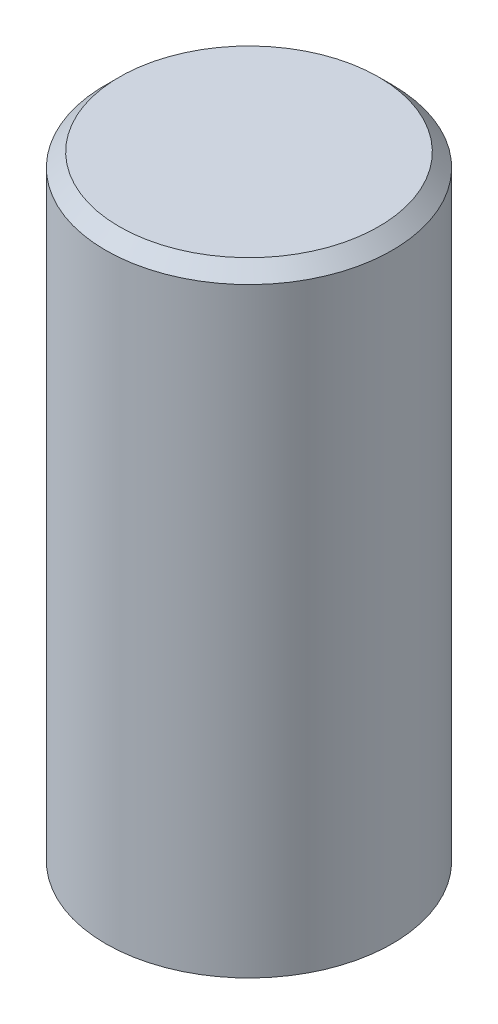
ISO-10303-21;
HEADER;
FILE_DESCRIPTION(('STEP AP214'),'2;1');
FILE_NAME('part.step','',(''),(''),'','','');
FILE_SCHEMA(('AUTOMOTIVE_DESIGN { 1 0 10303 214 1 1 1 1 }'));
ENDSEC;
DATA;
#1=APPLICATION_CONTEXT('core data for automotive mechanical design processes');
#2=APPLICATION_PROTOCOL_DEFINITION('international standard','automotive_design',2000,#1);
#3=PRODUCT_CONTEXT('',#1,'mechanical');
#4=PRODUCT('Part','Part','',(#3));
#5=PRODUCT_RELATED_PRODUCT_CATEGORY('part','',(#4));
#6=PRODUCT_DEFINITION_FORMATION('','',#4);
#7=PRODUCT_DEFINITION_CONTEXT('part definition',#1,'design');
#8=PRODUCT_DEFINITION('design','',#6,#7);
#9=PRODUCT_DEFINITION_SHAPE('','',#8);
#10=(LENGTH_UNIT() NAMED_UNIT(*) SI_UNIT(.MILLI.,.METRE.));
#11=(NAMED_UNIT(*) PLANE_ANGLE_UNIT() SI_UNIT($,.RADIAN.));
#12=(NAMED_UNIT(*) SI_UNIT($,.STERADIAN.) SOLID_ANGLE_UNIT());
#13=UNCERTAINTY_MEASURE_WITH_UNIT(LENGTH_MEASURE(1.E-05),#10,'distance_accuracy_value','');
#14=(GEOMETRIC_REPRESENTATION_CONTEXT(3) GLOBAL_UNCERTAINTY_ASSIGNED_CONTEXT((#13)) GLOBAL_UNIT_ASSIGNED_CONTEXT((#10,
#11,#12)) REPRESENTATION_CONTEXT('',''));
#15=CARTESIAN_POINT('',(0.,0.,0.));
#16=DIRECTION('',(0.,0.,1.));
#17=DIRECTION('',(1.,0.,0.));
#18=AXIS2_PLACEMENT_3D('',#15,#16,#17);
#19=CARTESIAN_POINT('',(0.,90.,0.));
#20=DIRECTION('',(0.,-1.,0.));
#21=DIRECTION('',(0.,0.,-1.));
#22=AXIS2_PLACEMENT_3D('',#19,#20,#21);
#23=CYLINDRICAL_SURFACE('',#22,21.);
#24=CARTESIAN_POINT('',(0.,88.0000000000001,0.));
#25=DIRECTION('',(0.,1.,0.));
#26=DIRECTION('',(0.,0.,1.));
#27=AXIS2_PLACEMENT_3D('',#24,#25,#26);
#28=CIRCLE('',#27,21.);
#29=CARTESIAN_POINT('',(0.,88.,-21.));
#30=VERTEX_POINT('',#29);
#31=EDGE_CURVE('E10',#30,#30,#28,.F.);
#32=CARTESIAN_POINT('',(0.,0.,0.));
#33=DIRECTION('',(0.,1.,0.));
#34=DIRECTION('',(0.,0.,1.));
#35=AXIS2_PLACEMENT_3D('',#32,#33,#34);
#36=CIRCLE('',#35,21.);
#37=CARTESIAN_POINT('',(0.,0.,-21.));
#38=VERTEX_POINT('',#37);
#39=EDGE_CURVE('E67',#38,#38,#36,.T.);
#40=CARTESIAN_POINT('',(0.,88.,-21.));
#41=CARTESIAN_POINT('',(0.,87.0833333333334,-21.));
#42=CARTESIAN_POINT('',(0.,86.1666666666667,-21.));
#43=CARTESIAN_POINT('',(0.,84.3333333333334,-21.));
#44=CARTESIAN_POINT('',(0.,83.4166666666667,-21.));
#45=CARTESIAN_POINT('',(0.,81.5833333333334,-21.));
#46=CARTESIAN_POINT('',(0.,80.6666666666667,-21.));
#47=CARTESIAN_POINT('',(0.,78.8333333333334,-21.));
#48=CARTESIAN_POINT('',(0.,77.9166666666667,-21.));
#49=CARTESIAN_POINT('',(0.,76.0833333333334,-21.));
#50=CARTESIAN_POINT('',(0.,75.1666666666667,-21.));
#51=CARTESIAN_POINT('',(0.,73.3333333333334,-21.));
#52=CARTESIAN_POINT('',(0.,72.4166666666667,-21.));
#53=CARTESIAN_POINT('',(0.,70.5833333333334,-21.));
#54=CARTESIAN_POINT('',(0.,69.6666666666667,-21.));
#55=CARTESIAN_POINT('',(0.,67.8333333333334,-21.));
#56=CARTESIAN_POINT('',(0.,66.9166666666667,-21.));
#57=CARTESIAN_POINT('',(0.,65.0833333333334,-21.));
#58=CARTESIAN_POINT('',(0.,64.1666666666667,-21.));
#59=CARTESIAN_POINT('',(0.,62.3333333333334,-21.));
#60=CARTESIAN_POINT('',(0.,61.4166666666667,-21.));
#61=CARTESIAN_POINT('',(0.,59.5833333333334,-21.));
#62=CARTESIAN_POINT('',(0.,58.6666666666667,-21.));
#63=CARTESIAN_POINT('',(0.,56.8333333333334,-21.));
#64=CARTESIAN_POINT('',(0.,55.9166666666667,-21.));
#65=CARTESIAN_POINT('',(0.,54.0833333333334,-21.));
#66=CARTESIAN_POINT('',(0.,53.1666666666667,-21.));
#67=CARTESIAN_POINT('',(0.,51.3333333333334,-21.));
#68=CARTESIAN_POINT('',(0.,50.4166666666667,-21.));
#69=CARTESIAN_POINT('',(0.,48.5833333333333,-21.));
#70=CARTESIAN_POINT('',(0.,47.6666666666667,-21.));
#71=CARTESIAN_POINT('',(0.,45.8333333333333,-21.));
#72=CARTESIAN_POINT('',(0.,44.9166666666667,-21.));
#73=CARTESIAN_POINT('',(0.,43.0833333333333,-21.));
#74=CARTESIAN_POINT('',(0.,42.1666666666667,-21.));
#75=CARTESIAN_POINT('',(0.,40.3333333333333,-21.));
#76=CARTESIAN_POINT('',(0.,39.4166666666667,-21.));
#77=CARTESIAN_POINT('',(0.,37.5833333333333,-21.));
#78=CARTESIAN_POINT('',(0.,36.6666666666667,-21.));
#79=CARTESIAN_POINT('',(0.,34.8333333333333,-21.));
#80=CARTESIAN_POINT('',(0.,33.9166666666667,-21.));
#81=CARTESIAN_POINT('',(0.,32.0833333333333,-21.));
#82=CARTESIAN_POINT('',(0.,31.1666666666667,-21.));
#83=CARTESIAN_POINT('',(0.,29.3333333333333,-21.));
#84=CARTESIAN_POINT('',(0.,28.4166666666667,-21.));
#85=CARTESIAN_POINT('',(0.,26.5833333333333,-21.));
#86=CARTESIAN_POINT('',(0.,25.6666666666667,-21.));
#87=CARTESIAN_POINT('',(0.,23.8333333333333,-21.));
#88=CARTESIAN_POINT('',(0.,22.9166666666667,-21.));
#89=CARTESIAN_POINT('',(0.,21.0833333333333,-21.));
#90=CARTESIAN_POINT('',(0.,20.1666666666667,-21.));
#91=CARTESIAN_POINT('',(0.,18.3333333333333,-21.));
#92=CARTESIAN_POINT('',(0.,17.4166666666667,-21.));
#93=CARTESIAN_POINT('',(0.,15.5833333333333,-21.));
#94=CARTESIAN_POINT('',(0.,14.6666666666667,-21.));
#95=CARTESIAN_POINT('',(0.,12.8333333333333,-21.));
#96=CARTESIAN_POINT('',(0.,11.9166666666667,-21.));
#97=CARTESIAN_POINT('',(0.,10.0833333333333,-21.));
#98=CARTESIAN_POINT('',(0.,9.16666666666666,-21.));
#99=CARTESIAN_POINT('',(0.,7.33333333333333,-21.));
#100=CARTESIAN_POINT('',(0.,6.41666666666666,-21.));
#101=CARTESIAN_POINT('',(0.,4.58333333333332,-21.));
#102=CARTESIAN_POINT('',(0.,3.66666666666666,-21.));
#103=CARTESIAN_POINT('',(0.,1.83333333333332,-21.));
#104=CARTESIAN_POINT('',(0.,0.916666666666653,-21.));
#105=CARTESIAN_POINT('',(0.,0.,-21.));
#106=B_SPLINE_CURVE_WITH_KNOTS('',3,(#40,#41,#42,#43,#44,#45,#46,#47,#48,#49,#50,#51,#52,#53,
#54,#55,#56,#57,#58,#59,#60,#61,#62,#63,#64,#65,#66,#67,#68,#69,#70,#71,#72,#73,#74,#75,#76,#77,
#78,#79,#80,#81,#82,#83,#84,#85,#86,#87,#88,#89,#90,#91,#92,#93,#94,#95,#96,#97,#98,#99,#100,
#101,#102,#103,#104,#105),.UNSPECIFIED.,.F.,.F.,(4,2,2,2,2,2,2,2,2,2,2,2,2,2,2,2,2,2,2,2,2,2,2,
2,2,2,2,2,2,2,2,2,4),(0.,2.74999999999999,5.49999999999999,8.24999999999999,11.,13.75,16.5,
19.25,22.,24.75,27.5,30.25,33.,35.75,38.5,41.25,44.,46.75,49.5,52.25,55.,57.75,60.5,63.25,66.,
68.75,71.5,74.25,77.,79.75,82.5,85.25,88.0000000000001),.UNSPECIFIED.);
#107=EDGE_CURVE('BSEAM53',#30,#38,#106,.T.);
#108=ORIENTED_EDGE('',*,*,#31,.T.);
#109=ORIENTED_EDGE('',*,*,#39,.T.);
#110=ORIENTED_EDGE('',*,*,#107,.T.);
#111=ORIENTED_EDGE('',*,*,#107,.F.);
#112=EDGE_LOOP('',(#108,#110,#109,#111));
#113=FACE_BOUND('',#112,.T.);
#114=ADVANCED_FACE('F53',(#113),#23,.T.);
#115=CARTESIAN_POINT('',(0.,90.,0.));
#116=DIRECTION('',(0.,1.,0.));
#117=DIRECTION('',(0.,0.,1.));
#118=AXIS2_PLACEMENT_3D('',#115,#116,#117);
#119=PLANE('',#118);
#120=CARTESIAN_POINT('',(0.,90.,0.));
#121=DIRECTION('',(0.,1.,0.));
#122=DIRECTION('',(0.,0.,1.));
#123=AXIS2_PLACEMENT_3D('',#120,#121,#122);
#124=CIRCLE('',#123,19.0000000000001);
#125=CARTESIAN_POINT('',(0.,90.,19.0000000000001));
#126=VERTEX_POINT('',#125);
#127=EDGE_CURVE('E62',#126,#126,#124,.T.);
#128=ORIENTED_EDGE('',*,*,#127,.T.);
#129=EDGE_LOOP('',(#128));
#130=FACE_BOUND('',#129,.T.);
#131=ADVANCED_FACE('F78',(#130),#119,.T.);
#132=CARTESIAN_POINT('',(0.,0.,0.));
#133=DIRECTION('',(0.,1.,0.));
#134=DIRECTION('',(0.,0.,1.));
#135=AXIS2_PLACEMENT_3D('',#132,#133,#134);
#136=PLANE('',#135);
#137=ORIENTED_EDGE('',*,*,#39,.F.);
#138=EDGE_LOOP('',(#137));
#139=FACE_BOUND('',#138,.T.);
#140=ADVANCED_FACE('F76',(#139),#136,.F.);
#141=CARTESIAN_POINT('',(0.,90.,0.));
#142=DIRECTION('',(0.,-1.,0.));
#143=DIRECTION('',(0.,0.,-1.));
#144=AXIS2_PLACEMENT_3D('',#141,#142,#143);
#145=CONICAL_SURFACE('',#144,19.0000000000001,0.785398163397445);
#146=ORIENTED_EDGE('',*,*,#31,.F.);
#147=EDGE_LOOP('',(#146));
#148=FACE_BOUND('',#147,.T.);
#149=ORIENTED_EDGE('',*,*,#127,.F.);
#150=EDGE_LOOP('',(#149));
#151=FACE_BOUND('',#150,.T.);
#152=ADVANCED_FACE('F56',(#148,#151),#145,.T.);
#153=CLOSED_SHELL('',(#114,#131,#140,#152));
#154=MANIFOLD_SOLID_BREP('B2',#153);
#155=ADVANCED_BREP_SHAPE_REPRESENTATION('',(#18,#154),#14);
#156=SHAPE_DEFINITION_REPRESENTATION(#9,#155);
ENDSEC;
END-ISO-10303-21;
